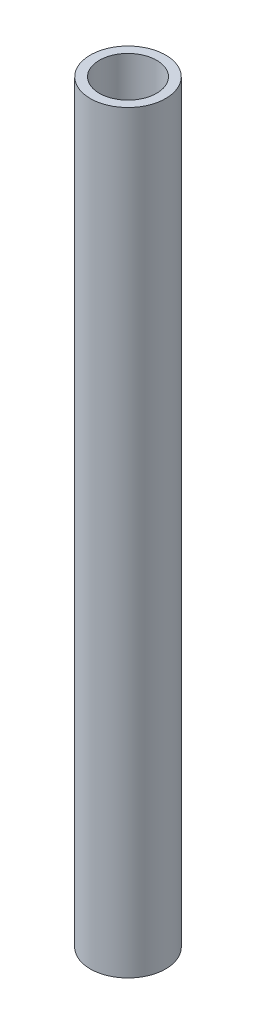
ISO-10303-21;
HEADER;
FILE_DESCRIPTION(('STEP AP214'),'2;1');
FILE_NAME('part.step','',(''),(''),'','','');
FILE_SCHEMA(('AUTOMOTIVE_DESIGN { 1 0 10303 214 1 1 1 1 }'));
ENDSEC;
DATA;
#1=APPLICATION_CONTEXT('core data for automotive mechanical design processes');
#2=APPLICATION_PROTOCOL_DEFINITION('international standard','automotive_design',2000,#1);
#3=PRODUCT_CONTEXT('',#1,'mechanical');
#4=PRODUCT('Part','Part','',(#3));
#5=PRODUCT_RELATED_PRODUCT_CATEGORY('part','',(#4));
#6=PRODUCT_DEFINITION_FORMATION('','',#4);
#7=PRODUCT_DEFINITION_CONTEXT('part definition',#1,'design');
#8=PRODUCT_DEFINITION('design','',#6,#7);
#9=PRODUCT_DEFINITION_SHAPE('','',#8);
#10=(LENGTH_UNIT() NAMED_UNIT(*) SI_UNIT(.MILLI.,.METRE.));
#11=(NAMED_UNIT(*) PLANE_ANGLE_UNIT() SI_UNIT($,.RADIAN.));
#12=(NAMED_UNIT(*) SI_UNIT($,.STERADIAN.) SOLID_ANGLE_UNIT());
#13=UNCERTAINTY_MEASURE_WITH_UNIT(LENGTH_MEASURE(1.E-05),#10,'distance_accuracy_value','');
#14=(GEOMETRIC_REPRESENTATION_CONTEXT(3) GLOBAL_UNCERTAINTY_ASSIGNED_CONTEXT((#13)) GLOBAL_UNIT_ASSIGNED_CONTEXT((#10,
#11,#12)) REPRESENTATION_CONTEXT('',''));
#15=CARTESIAN_POINT('',(0.,0.,0.));
#16=DIRECTION('',(0.,0.,1.));
#17=DIRECTION('',(1.,0.,0.));
#18=AXIS2_PLACEMENT_3D('',#15,#16,#17);
#19=CARTESIAN_POINT('',(0.,100.,0.));
#20=DIRECTION('',(0.,1.,0.));
#21=DIRECTION('',(0.,0.,1.));
#22=AXIS2_PLACEMENT_3D('',#19,#20,#21);
#23=PLANE('',#22);
#24=CARTESIAN_POINT('',(0.,100.,0.));
#25=DIRECTION('',(0.,1.,0.));
#26=DIRECTION('',(0.,0.,1.));
#27=AXIS2_PLACEMENT_3D('',#24,#25,#26);
#28=CIRCLE('',#27,5.);
#29=CARTESIAN_POINT('',(0.,100.,5.));
#30=VERTEX_POINT('',#29);
#31=EDGE_CURVE('E10',#30,#30,#28,.T.);
#32=ORIENTED_EDGE('',*,*,#31,.T.);
#33=EDGE_LOOP('',(#32));
#34=FACE_BOUND('',#33,.T.);
#35=CARTESIAN_POINT('',(0.,100.,0.));
#36=DIRECTION('',(0.,1.,0.));
#37=DIRECTION('',(0.,0.,1.));
#38=AXIS2_PLACEMENT_3D('',#35,#36,#37);
#39=CIRCLE('',#38,3.8);
#40=CARTESIAN_POINT('',(0.,100.,3.8));
#41=VERTEX_POINT('',#40);
#42=EDGE_CURVE('E48',#41,#41,#39,.T.);
#43=ORIENTED_EDGE('',*,*,#42,.F.);
#44=EDGE_LOOP('',(#43));
#45=FACE_BOUND('',#44,.T.);
#46=ADVANCED_FACE('F37',(#34,#45),#23,.T.);
#47=CARTESIAN_POINT('',(0.,0.,0.));
#48=DIRECTION('',(0.,1.,0.));
#49=DIRECTION('',(0.,0.,1.));
#50=AXIS2_PLACEMENT_3D('',#47,#48,#49);
#51=PLANE('',#50);
#52=CARTESIAN_POINT('',(0.,0.,0.));
#53=DIRECTION('',(0.,1.,0.));
#54=DIRECTION('',(0.,0.,1.));
#55=AXIS2_PLACEMENT_3D('',#52,#53,#54);
#56=CIRCLE('',#55,5.);
#57=CARTESIAN_POINT('',(0.,0.,5.));
#58=VERTEX_POINT('',#57);
#59=EDGE_CURVE('E41',#58,#58,#56,.T.);
#60=ORIENTED_EDGE('',*,*,#59,.F.);
#61=EDGE_LOOP('',(#60));
#62=FACE_BOUND('',#61,.T.);
#63=CARTESIAN_POINT('',(0.,0.,0.));
#64=DIRECTION('',(0.,1.,0.));
#65=DIRECTION('',(0.,0.,1.));
#66=AXIS2_PLACEMENT_3D('',#63,#64,#65);
#67=CIRCLE('',#66,3.8);
#68=CARTESIAN_POINT('',(0.,0.,3.8));
#69=VERTEX_POINT('',#68);
#70=EDGE_CURVE('E50',#69,#69,#67,.T.);
#71=ORIENTED_EDGE('',*,*,#70,.T.);
#72=EDGE_LOOP('',(#71));
#73=FACE_BOUND('',#72,.T.);
#74=ADVANCED_FACE('F60',(#62,#73),#51,.F.);
#75=CARTESIAN_POINT('',(0.,100.,0.));
#76=DIRECTION('',(0.,-1.,0.));
#77=DIRECTION('',(0.,0.,-1.));
#78=AXIS2_PLACEMENT_3D('',#75,#76,#77);
#79=CYLINDRICAL_SURFACE('',#78,5.);
#80=ORIENTED_EDGE('',*,*,#31,.F.);
#81=EDGE_LOOP('',(#80));
#82=FACE_BOUND('',#81,.T.);
#83=ORIENTED_EDGE('',*,*,#59,.T.);
#84=EDGE_LOOP('',(#83));
#85=FACE_BOUND('',#84,.T.);
#86=ADVANCED_FACE('F39',(#82,#85),#79,.T.);
#87=CARTESIAN_POINT('',(0.,100.,0.));
#88=DIRECTION('',(0.,-1.,0.));
#89=DIRECTION('',(0.,0.,-1.));
#90=AXIS2_PLACEMENT_3D('',#87,#88,#89);
#91=CYLINDRICAL_SURFACE('',#90,3.8);
#92=ORIENTED_EDGE('',*,*,#42,.T.);
#93=EDGE_LOOP('',(#92));
#94=FACE_BOUND('',#93,.T.);
#95=ORIENTED_EDGE('',*,*,#70,.F.);
#96=EDGE_LOOP('',(#95));
#97=FACE_BOUND('',#96,.T.);
#98=ADVANCED_FACE('F56',(#94,#97),#91,.F.);
#99=CLOSED_SHELL('',(#46,#74,#86,#98));
#100=MANIFOLD_SOLID_BREP('B2',#99);
#101=ADVANCED_BREP_SHAPE_REPRESENTATION('',(#18,#100),#14);
#102=SHAPE_DEFINITION_REPRESENTATION(#9,#101);
ENDSEC;
END-ISO-10303-21;
